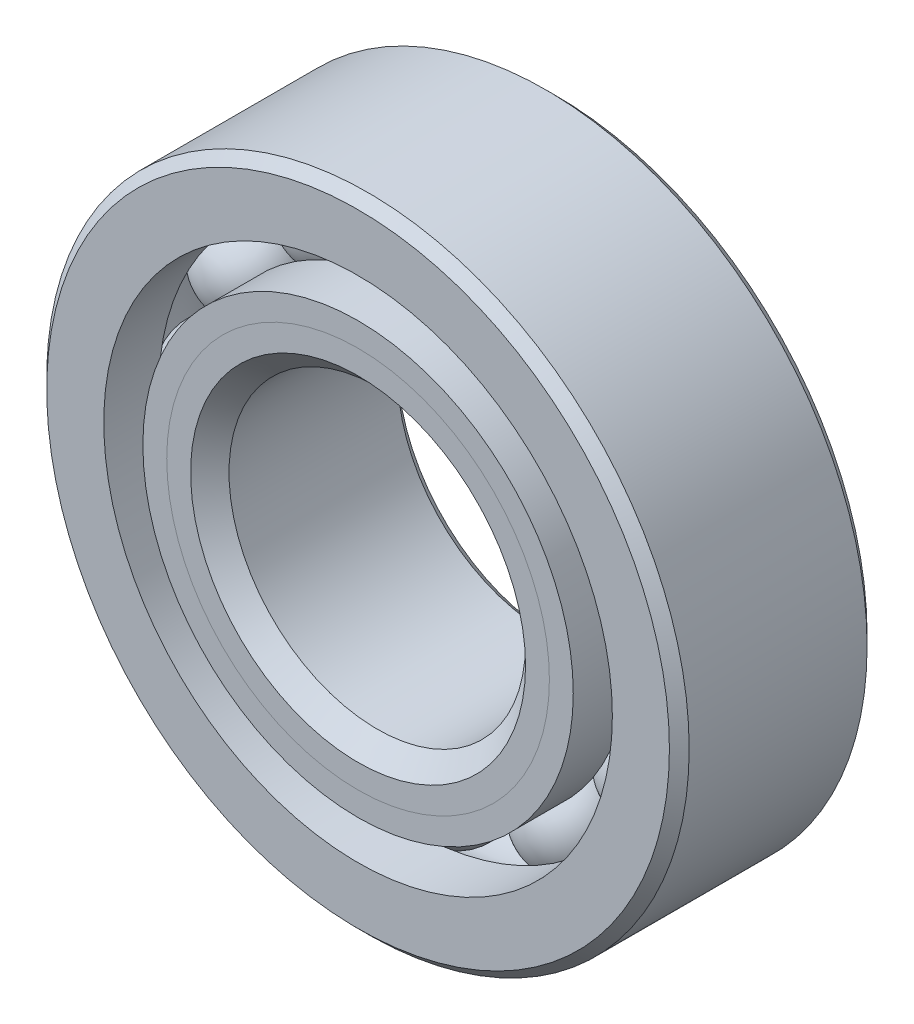
ISO-10303-21;
HEADER;
FILE_DESCRIPTION(('STEP AP214'),'2;1');
FILE_NAME('part.step','',(''),(''),'','','');
FILE_SCHEMA(('AUTOMOTIVE_DESIGN { 1 0 10303 214 1 1 1 1 }'));
ENDSEC;
DATA;
#1=APPLICATION_CONTEXT('core data for automotive mechanical design processes');
#2=APPLICATION_PROTOCOL_DEFINITION('international standard','automotive_design',2000,#1);
#3=PRODUCT_CONTEXT('',#1,'mechanical');
#4=PRODUCT('Part','Part','',(#3));
#5=PRODUCT_RELATED_PRODUCT_CATEGORY('part','',(#4));
#6=PRODUCT_DEFINITION_FORMATION('','',#4);
#7=PRODUCT_DEFINITION_CONTEXT('part definition',#1,'design');
#8=PRODUCT_DEFINITION('design','',#6,#7);
#9=PRODUCT_DEFINITION_SHAPE('','',#8);
#10=(LENGTH_UNIT() NAMED_UNIT(*) SI_UNIT(.MILLI.,.METRE.));
#11=(NAMED_UNIT(*) PLANE_ANGLE_UNIT() SI_UNIT($,.RADIAN.));
#12=(NAMED_UNIT(*) SI_UNIT($,.STERADIAN.) SOLID_ANGLE_UNIT());
#13=UNCERTAINTY_MEASURE_WITH_UNIT(LENGTH_MEASURE(1.E-05),#10,'distance_accuracy_value','');
#14=(GEOMETRIC_REPRESENTATION_CONTEXT(3) GLOBAL_UNCERTAINTY_ASSIGNED_CONTEXT((#13)) GLOBAL_UNIT_ASSIGNED_CONTEXT((#10,
#11,#12)) REPRESENTATION_CONTEXT('',''));
#15=CARTESIAN_POINT('',(0.,0.,0.));
#16=DIRECTION('',(0.,0.,1.));
#17=DIRECTION('',(1.,0.,0.));
#18=AXIS2_PLACEMENT_3D('',#15,#16,#17);
#19=CARTESIAN_POINT('',(-7.54062499999983,13.0607456208242,0.));
#20=DIRECTION('',(0.,0.,1.));
#21=DIRECTION('',(-0.499999999999989,0.866025403784445,0.));
#22=AXIS2_PLACEMENT_3D('',#19,#20,#21);
#23=SPHERICAL_SURFACE('',#22,3.08910742628344);
#24=CARTESIAN_POINT('',(-7.54062499999983,13.0607456208242,3.08910742628344));
#25=VERTEX_POINT('',#24);
#26=VERTEX_LOOP('',#25);
#27=FACE_BOUND('',#26,.T.);
#28=ADVANCED_FACE('F45',(#27),#23,.T.);
#29=CLOSED_SHELL('',(#28));
#30=MANIFOLD_SOLID_BREP('B2',#29);
#31=CARTESIAN_POINT('',(-13.060745620824,7.54062500000015,0.));
#32=DIRECTION('',(0.,0.,1.));
#33=DIRECTION('',(-0.866025403784433,0.50000000000001,0.));
#34=AXIS2_PLACEMENT_3D('',#31,#32,#33);
#35=SPHERICAL_SURFACE('',#34,3.08910742628344);
#36=CARTESIAN_POINT('',(-13.060745620824,7.54062500000015,3.08910742628344));
#37=VERTEX_POINT('',#36);
#38=VERTEX_LOOP('',#37);
#39=FACE_BOUND('',#38,.T.);
#40=ADVANCED_FACE('F81',(#39),#35,.T.);
#41=CLOSED_SHELL('',(#40));
#42=MANIFOLD_SOLID_BREP('B6',#41);
#43=CARTESIAN_POINT('',(-15.08125,1.57967708824284E-13,0.));
#44=DIRECTION('',(0.,0.,1.));
#45=DIRECTION('',(-1.,0.,0.));
#46=AXIS2_PLACEMENT_3D('',#43,#44,#45);
#47=SPHERICAL_SURFACE('',#46,3.08910742628344);
#48=CARTESIAN_POINT('',(-15.08125,1.57967708824284E-13,3.08910742628344));
#49=VERTEX_POINT('',#48);
#50=VERTEX_LOOP('',#49);
#51=FACE_BOUND('',#50,.T.);
#52=ADVANCED_FACE('F117',(#51),#47,.T.);
#53=CLOSED_SHELL('',(#52));
#54=MANIFOLD_SOLID_BREP('B41',#53);
#55=CARTESIAN_POINT('',(-13.0607456208241,-7.54062499999988,0.));
#56=DIRECTION('',(0.,0.,1.));
#57=DIRECTION('',(-0.866025403784443,-0.499999999999992,0.));
#58=AXIS2_PLACEMENT_3D('',#55,#56,#57);
#59=SPHERICAL_SURFACE('',#58,3.08910742628344);
#60=CARTESIAN_POINT('',(-13.0607456208241,-7.54062499999988,3.08910742628344));
#61=VERTEX_POINT('',#60);
#62=VERTEX_LOOP('',#61);
#63=FACE_BOUND('',#62,.T.);
#64=ADVANCED_FACE('F153',(#63),#59,.T.);
#65=CLOSED_SHELL('',(#64));
#66=MANIFOLD_SOLID_BREP('B77',#65);
#67=CARTESIAN_POINT('',(-7.54062500000011,-13.060745620824,0.));
#68=DIRECTION('',(0.,0.,1.));
#69=DIRECTION('',(-0.500000000000007,-0.866025403784435,0.));
#70=AXIS2_PLACEMENT_3D('',#67,#68,#69);
#71=SPHERICAL_SURFACE('',#70,3.08910742628344);
#72=CARTESIAN_POINT('',(-7.54062500000011,-13.060745620824,3.08910742628344));
#73=VERTEX_POINT('',#72);
#74=VERTEX_LOOP('',#73);
#75=FACE_BOUND('',#74,.T.);
#76=ADVANCED_FACE('F187',(#75),#71,.T.);
#77=CLOSED_SHELL('',(#76));
#78=MANIFOLD_SOLID_BREP('B113',#77);
#79=CARTESIAN_POINT('',(-1.05311805882856E-13,-15.08125,0.));
#80=DIRECTION('',(0.,0.,1.));
#81=DIRECTION('',(0.,-1.,0.));
#82=AXIS2_PLACEMENT_3D('',#79,#80,#81);
#83=SPHERICAL_SURFACE('',#82,3.08910742628344);
#84=CARTESIAN_POINT('',(-1.05311805882856E-13,-15.08125,3.08910742628344));
#85=VERTEX_POINT('',#84);
#86=VERTEX_LOOP('',#85);
#87=FACE_BOUND('',#86,.T.);
#88=ADVANCED_FACE('F221',(#87),#83,.T.);
#89=CLOSED_SHELL('',(#88));
#90=MANIFOLD_SOLID_BREP('B149',#89);
#91=CARTESIAN_POINT('',(7.54062499999992,-13.0607456208241,0.));
#92=DIRECTION('',(0.,0.,1.));
#93=DIRECTION('',(0.499999999999995,-0.866025403784442,0.));
#94=AXIS2_PLACEMENT_3D('',#91,#92,#93);
#95=SPHERICAL_SURFACE('',#94,3.08910742628344);
#96=CARTESIAN_POINT('',(7.54062499999992,-13.0607456208241,3.08910742628344));
#97=VERTEX_POINT('',#96);
#98=VERTEX_LOOP('',#97);
#99=FACE_BOUND('',#98,.T.);
#100=ADVANCED_FACE('F255',(#99),#95,.T.);
#101=CLOSED_SHELL('',(#100));
#102=MANIFOLD_SOLID_BREP('B183',#101);
#103=CARTESIAN_POINT('',(13.060745620824,-7.54062500000006,0.));
#104=DIRECTION('',(0.,0.,1.));
#105=DIRECTION('',(0.866025403784436,-0.500000000000004,0.));
#106=AXIS2_PLACEMENT_3D('',#103,#104,#105);
#107=SPHERICAL_SURFACE('',#106,3.08910742628344);
#108=CARTESIAN_POINT('',(13.060745620824,-7.54062500000006,3.08910742628344));
#109=VERTEX_POINT('',#108);
#110=VERTEX_LOOP('',#109);
#111=FACE_BOUND('',#110,.T.);
#112=ADVANCED_FACE('F291',(#111),#107,.T.);
#113=CLOSED_SHELL('',(#112));
#114=MANIFOLD_SOLID_BREP('B217',#113);
#115=CARTESIAN_POINT('',(15.08125,0.,0.));
#116=DIRECTION('',(0.,0.,1.));
#117=DIRECTION('',(1.,0.,0.));
#118=AXIS2_PLACEMENT_3D('',#115,#116,#117);
#119=SPHERICAL_SURFACE('',#118,3.08910742628344);
#120=CARTESIAN_POINT('',(15.08125,0.,3.08910742628344));
#121=VERTEX_POINT('',#120);
#122=VERTEX_LOOP('',#121);
#123=FACE_BOUND('',#122,.T.);
#124=ADVANCED_FACE('F327',(#123),#119,.T.);
#125=CLOSED_SHELL('',(#124));
#126=MANIFOLD_SOLID_BREP('B251',#125);
#127=CARTESIAN_POINT('',(13.0607456208241,7.54062499999997,0.));
#128=DIRECTION('',(0.,0.,1.));
#129=DIRECTION('',(0.86602540378444,0.499999999999998,0.));
#130=AXIS2_PLACEMENT_3D('',#127,#128,#129);
#131=SPHERICAL_SURFACE('',#130,3.08910742628344);
#132=CARTESIAN_POINT('',(13.0607456208241,7.54062499999997,3.08910742628344));
#133=VERTEX_POINT('',#132);
#134=VERTEX_LOOP('',#133);
#135=FACE_BOUND('',#134,.T.);
#136=ADVANCED_FACE('F361',(#135),#131,.T.);
#137=CLOSED_SHELL('',(#136));
#138=MANIFOLD_SOLID_BREP('B287',#137);
#139=CARTESIAN_POINT('',(7.54062500000001,13.0607456208241,0.));
#140=DIRECTION('',(0.,0.,1.));
#141=DIRECTION('',(0.500000000000001,0.866025403784438,0.));
#142=AXIS2_PLACEMENT_3D('',#139,#140,#141);
#143=SPHERICAL_SURFACE('',#142,3.08910742628344);
#144=CARTESIAN_POINT('',(7.54062500000001,13.0607456208241,3.08910742628344));
#145=VERTEX_POINT('',#144);
#146=VERTEX_LOOP('',#145);
#147=FACE_BOUND('',#146,.T.);
#148=ADVANCED_FACE('F395',(#147),#143,.T.);
#149=CLOSED_SHELL('',(#148));
#150=MANIFOLD_SOLID_BREP('B323',#149);
#151=CARTESIAN_POINT('',(0.,15.08125,0.));
#152=DIRECTION('',(0.,0.,1.));
#153=DIRECTION('',(0.,1.,0.));
#154=AXIS2_PLACEMENT_3D('',#151,#152,#153);
#155=SPHERICAL_SURFACE('',#154,3.08910742628344);
#156=CARTESIAN_POINT('',(0.,15.08125,3.08910742628344));
#157=VERTEX_POINT('',#156);
#158=VERTEX_LOOP('',#157);
#159=FACE_BOUND('',#158,.T.);
#160=ADVANCED_FACE('F431',(#159),#155,.T.);
#161=CLOSED_SHELL('',(#160));
#162=MANIFOLD_SOLID_BREP('B357',#161);
#163=CARTESIAN_POINT('',(0.,12.2918886654072,6.35));
#164=DIRECTION('',(0.,0.,-1.));
#165=DIRECTION('',(-1.,0.,0.));
#166=AXIS2_PLACEMENT_3D('',#163,#164,#165);
#167=PLANE('',#166);
#168=CARTESIAN_POINT('',(0.,0.,6.35));
#169=DIRECTION('',(0.,0.,1.));
#170=DIRECTION('',(1.,0.,0.));
#171=AXIS2_PLACEMENT_3D('',#168,#169,#170);
#172=CIRCLE('',#171,10.7585712868583);
#173=CARTESIAN_POINT('',(10.7585712868583,0.,6.35));
#174=VERTEX_POINT('',#173);
#175=EDGE_CURVE('E485',#174,#174,#172,.T.);
#176=ORIENTED_EDGE('',*,*,#175,.F.);
#177=EDGE_LOOP('',(#176));
#178=FACE_BOUND('',#177,.T.);
#179=CARTESIAN_POINT('',(0.,0.,6.35));
#180=DIRECTION('',(0.,0.,1.));
#181=DIRECTION('',(1.,0.,0.));
#182=AXIS2_PLACEMENT_3D('',#179,#180,#181);
#183=CIRCLE('',#182,12.2918886654072);
#184=CARTESIAN_POINT('',(12.2918886654072,0.,6.35));
#185=VERTEX_POINT('',#184);
#186=EDGE_CURVE('E430',#185,#185,#183,.T.);
#187=ORIENTED_EDGE('',*,*,#186,.T.);
#188=EDGE_LOOP('',(#187));
#189=FACE_BOUND('',#188,.T.);
#190=ADVANCED_FACE('F451',(#178,#189),#167,.F.);
#191=CARTESIAN_POINT('',(0.,0.,4.81668262145113));
#192=DIRECTION('',(0.,0.,1.));
#193=DIRECTION('',(1.,0.,0.));
#194=AXIS2_PLACEMENT_3D('',#191,#192,#193);
#195=CONICAL_SURFACE('',#194,10.7585712868583,0.78539816339745);
#196=ORIENTED_EDGE('',*,*,#186,.F.);
#197=EDGE_LOOP('',(#196));
#198=FACE_BOUND('',#197,.T.);
#199=CARTESIAN_POINT('',(0.,0.,4.81668262145113));
#200=DIRECTION('',(0.,0.,1.));
#201=DIRECTION('',(1.,0.,0.));
#202=AXIS2_PLACEMENT_3D('',#199,#200,#201);
#203=CIRCLE('',#202,10.7585712868583);
#204=CARTESIAN_POINT('',(10.7585712868583,0.,4.81668262145113));
#205=VERTEX_POINT('',#204);
#206=EDGE_CURVE('E457',#205,#205,#203,.T.);
#207=ORIENTED_EDGE('',*,*,#206,.T.);
#208=EDGE_LOOP('',(#207));
#209=FACE_BOUND('',#208,.T.);
#210=ADVANCED_FACE('F492',(#198,#209),#195,.T.);
#211=CARTESIAN_POINT('',(0.,0.,6.35));
#212=DIRECTION('',(0.,0.,1.));
#213=DIRECTION('',(1.,0.,0.));
#214=AXIS2_PLACEMENT_3D('',#211,#212,#213);
#215=CYLINDRICAL_SURFACE('',#214,10.7585712868583);
#216=ORIENTED_EDGE('',*,*,#206,.F.);
#217=EDGE_LOOP('',(#216));
#218=FACE_BOUND('',#217,.T.);
#219=CARTESIAN_POINT('',(0.,0.,0.));
#220=DIRECTION('',(0.,0.,1.));
#221=DIRECTION('',(1.,0.,0.));
#222=AXIS2_PLACEMENT_3D('',#219,#220,#221);
#223=CIRCLE('',#222,10.7585712868583);
#224=CARTESIAN_POINT('',(10.7585712868583,0.,0.));
#225=VERTEX_POINT('',#224);
#226=EDGE_CURVE('E461',#225,#225,#223,.T.);
#227=ORIENTED_EDGE('',*,*,#226,.T.);
#228=EDGE_LOOP('',(#227));
#229=FACE_BOUND('',#228,.T.);
#230=ADVANCED_FACE('F496',(#218,#229),#215,.T.);
#231=CARTESIAN_POINT('',(0.,10.7585712868583,0.));
#232=DIRECTION('',(0.,0.,-1.));
#233=DIRECTION('',(-1.,0.,0.));
#234=AXIS2_PLACEMENT_3D('',#231,#232,#233);
#235=PLANE('',#234);
#236=ORIENTED_EDGE('',*,*,#226,.F.);
#237=EDGE_LOOP('',(#236));
#238=FACE_BOUND('',#237,.T.);
#239=CARTESIAN_POINT('',(0.,0.,0.));
#240=DIRECTION('',(0.,0.,1.));
#241=DIRECTION('',(1.,0.,0.));
#242=AXIS2_PLACEMENT_3D('',#239,#240,#241);
#243=CIRCLE('',#242,11.9921425737166);
#244=CARTESIAN_POINT('',(11.9921425737166,0.,0.));
#245=VERTEX_POINT('',#244);
#246=EDGE_CURVE('E465',#245,#245,#243,.T.);
#247=ORIENTED_EDGE('',*,*,#246,.T.);
#248=EDGE_LOOP('',(#247));
#249=FACE_BOUND('',#248,.T.);
#250=ADVANCED_FACE('F501',(#238,#249),#235,.F.);
#251=CARTESIAN_POINT('',(0.,0.,0.));
#252=DIRECTION('',(0.,0.,1.));
#253=DIRECTION('',(1.,0.,0.));
#254=AXIS2_PLACEMENT_3D('',#251,#252,#253);
#255=TOROIDAL_SURFACE('',#254,15.08125,3.08910742628344);
#256=ORIENTED_EDGE('',*,*,#246,.F.);
#257=EDGE_LOOP('',(#256));
#258=FACE_BOUND('',#257,.T.);
#259=CARTESIAN_POINT('',(0.,0.,-2.82222222222222));
#260=DIRECTION('',(0.,0.,1.));
#261=DIRECTION('',(1.,0.,0.));
#262=AXIS2_PLACEMENT_3D('',#259,#260,#261);
#263=CIRCLE('',#262,13.825206043956);
#264=CARTESIAN_POINT('',(13.825206043956,0.,-2.82222222222222));
#265=VERTEX_POINT('',#264);
#266=EDGE_CURVE('E470',#265,#265,#263,.T.);
#267=ORIENTED_EDGE('',*,*,#266,.T.);
#268=EDGE_LOOP('',(#267));
#269=FACE_BOUND('',#268,.T.);
#270=ADVANCED_FACE('F507',(#258,#269),#255,.F.);
#271=CARTESIAN_POINT('',(0.,0.,6.35));
#272=DIRECTION('',(0.,0.,1.));
#273=DIRECTION('',(1.,0.,0.));
#274=AXIS2_PLACEMENT_3D('',#271,#272,#273);
#275=CYLINDRICAL_SURFACE('',#274,13.825206043956);
#276=ORIENTED_EDGE('',*,*,#266,.F.);
#277=EDGE_LOOP('',(#276));
#278=FACE_BOUND('',#277,.T.);
#279=CARTESIAN_POINT('',(0.,0.,-6.35));
#280=DIRECTION('',(0.,0.,1.));
#281=DIRECTION('',(1.,0.,0.));
#282=AXIS2_PLACEMENT_3D('',#279,#280,#281);
#283=CIRCLE('',#282,13.825206043956);
#284=CARTESIAN_POINT('',(13.825206043956,0.,-6.35));
#285=VERTEX_POINT('',#284);
#286=EDGE_CURVE('E473',#285,#285,#283,.T.);
#287=ORIENTED_EDGE('',*,*,#286,.T.);
#288=EDGE_LOOP('',(#287));
#289=FACE_BOUND('',#288,.T.);
#290=ADVANCED_FACE('F511',(#278,#289),#275,.T.);
#291=CARTESIAN_POINT('',(0.,10.16,-6.35));
#292=DIRECTION('',(0.,0.,1.));
#293=DIRECTION('',(1.,0.,0.));
#294=AXIS2_PLACEMENT_3D('',#291,#292,#293);
#295=PLANE('',#294);
#296=ORIENTED_EDGE('',*,*,#286,.F.);
#297=EDGE_LOOP('',(#296));
#298=FACE_BOUND('',#297,.T.);
#299=CARTESIAN_POINT('',(0.,0.,-6.35));
#300=DIRECTION('',(0.,0.,1.));
#301=DIRECTION('',(1.,0.,0.));
#302=AXIS2_PLACEMENT_3D('',#299,#300,#301);
#303=CIRCLE('',#302,10.16);
#304=CARTESIAN_POINT('',(10.16,0.,-6.35));
#305=VERTEX_POINT('',#304);
#306=EDGE_CURVE('E476',#305,#305,#303,.T.);
#307=ORIENTED_EDGE('',*,*,#306,.T.);
#308=EDGE_LOOP('',(#307));
#309=FACE_BOUND('',#308,.T.);
#310=ADVANCED_FACE('F515',(#298,#309),#295,.F.);
#311=CARTESIAN_POINT('',(0.,0.,-5.715));
#312=DIRECTION('',(0.,0.,-1.));
#313=DIRECTION('',(-1.,0.,0.));
#314=AXIS2_PLACEMENT_3D('',#311,#312,#313);
#315=CONICAL_SURFACE('',#314,9.525,0.78539816339745);
#316=ORIENTED_EDGE('',*,*,#306,.F.);
#317=EDGE_LOOP('',(#316));
#318=FACE_BOUND('',#317,.T.);
#319=CARTESIAN_POINT('',(0.,0.,-5.715));
#320=DIRECTION('',(0.,0.,1.));
#321=DIRECTION('',(1.,0.,0.));
#322=AXIS2_PLACEMENT_3D('',#319,#320,#321);
#323=CIRCLE('',#322,9.525);
#324=CARTESIAN_POINT('',(9.525,0.,-5.715));
#325=VERTEX_POINT('',#324);
#326=EDGE_CURVE('E479',#325,#325,#323,.T.);
#327=ORIENTED_EDGE('',*,*,#326,.T.);
#328=EDGE_LOOP('',(#327));
#329=FACE_BOUND('',#328,.T.);
#330=ADVANCED_FACE('F519',(#318,#329),#315,.F.);
#331=CARTESIAN_POINT('',(0.,0.,6.35));
#332=DIRECTION('',(0.,0.,1.));
#333=DIRECTION('',(1.,0.,0.));
#334=AXIS2_PLACEMENT_3D('',#331,#332,#333);
#335=CYLINDRICAL_SURFACE('',#334,9.525);
#336=ORIENTED_EDGE('',*,*,#326,.F.);
#337=EDGE_LOOP('',(#336));
#338=FACE_BOUND('',#337,.T.);
#339=CARTESIAN_POINT('',(0.,0.,5.11642871314172));
#340=DIRECTION('',(0.,0.,1.));
#341=DIRECTION('',(1.,0.,0.));
#342=AXIS2_PLACEMENT_3D('',#339,#340,#341);
#343=CIRCLE('',#342,9.525);
#344=CARTESIAN_POINT('',(9.525,0.,5.11642871314172));
#345=VERTEX_POINT('',#344);
#346=EDGE_CURVE('E482',#345,#345,#343,.T.);
#347=ORIENTED_EDGE('',*,*,#346,.T.);
#348=EDGE_LOOP('',(#347));
#349=FACE_BOUND('',#348,.T.);
#350=ADVANCED_FACE('F523',(#338,#349),#335,.F.);
#351=CARTESIAN_POINT('',(0.,0.,6.35));
#352=DIRECTION('',(0.,0.,1.));
#353=DIRECTION('',(1.,0.,0.));
#354=AXIS2_PLACEMENT_3D('',#351,#352,#353);
#355=CONICAL_SURFACE('',#354,10.7585712868583,0.78539816339745);
#356=ORIENTED_EDGE('',*,*,#346,.F.);
#357=EDGE_LOOP('',(#356));
#358=FACE_BOUND('',#357,.T.);
#359=ORIENTED_EDGE('',*,*,#175,.T.);
#360=EDGE_LOOP('',(#359));
#361=FACE_BOUND('',#360,.T.);
#362=ADVANCED_FACE('F489',(#358,#361),#355,.F.);
#363=CLOSED_SHELL('',(#190,#210,#230,#250,#270,#290,#310,#330,#350,#362));
#364=MANIFOLD_SOLID_BREP('B391',#363);
#365=CARTESIAN_POINT('',(0.,13.825206043956,6.35));
#366=DIRECTION('',(0.,0.,-1.));
#367=DIRECTION('',(-1.,0.,0.));
#368=AXIS2_PLACEMENT_3D('',#365,#366,#367);
#369=PLANE('',#368);
#370=CARTESIAN_POINT('',(0.,0.,6.35));
#371=DIRECTION('',(0.,0.,1.));
#372=DIRECTION('',(1.,0.,0.));
#373=AXIS2_PLACEMENT_3D('',#370,#371,#372);
#374=CIRCLE('',#373,12.2918886654072);
#375=CARTESIAN_POINT('',(12.2918886654072,0.,6.35));
#376=VERTEX_POINT('',#375);
#377=EDGE_CURVE('E450',#376,#376,#374,.T.);
#378=ORIENTED_EDGE('',*,*,#377,.F.);
#379=EDGE_LOOP('',(#378));
#380=FACE_BOUND('',#379,.T.);
#381=CARTESIAN_POINT('',(0.,0.,6.35));
#382=DIRECTION('',(0.,0.,1.));
#383=DIRECTION('',(1.,0.,0.));
#384=AXIS2_PLACEMENT_3D('',#381,#382,#383);
#385=CIRCLE('',#384,13.825206043956);
#386=CARTESIAN_POINT('',(13.825206043956,0.,6.35));
#387=VERTEX_POINT('',#386);
#388=EDGE_CURVE('E631',#387,#387,#385,.T.);
#389=ORIENTED_EDGE('',*,*,#388,.T.);
#390=EDGE_LOOP('',(#389));
#391=FACE_BOUND('',#390,.T.);
#392=ADVANCED_FACE('F609',(#380,#391),#369,.F.);
#393=CARTESIAN_POINT('',(0.,0.,6.35));
#394=DIRECTION('',(0.,0.,1.));
#395=DIRECTION('',(1.,0.,0.));
#396=AXIS2_PLACEMENT_3D('',#393,#394,#395);
#397=CONICAL_SURFACE('',#396,12.2918886654072,0.78539816339745);
#398=CARTESIAN_POINT('',(0.,0.,4.81668262145113));
#399=DIRECTION('',(0.,0.,1.));
#400=DIRECTION('',(1.,0.,0.));
#401=AXIS2_PLACEMENT_3D('',#398,#399,#400);
#402=CIRCLE('',#401,10.7585712868583);
#403=CARTESIAN_POINT('',(10.7585712868583,0.,4.81668262145113));
#404=VERTEX_POINT('',#403);
#405=EDGE_CURVE('E615',#404,#404,#402,.T.);
#406=ORIENTED_EDGE('',*,*,#405,.F.);
#407=EDGE_LOOP('',(#406));
#408=FACE_BOUND('',#407,.T.);
#409=ORIENTED_EDGE('',*,*,#377,.T.);
#410=EDGE_LOOP('',(#409));
#411=FACE_BOUND('',#410,.T.);
#412=ADVANCED_FACE('F656',(#408,#411),#397,.F.);
#413=CARTESIAN_POINT('',(0.,0.,6.35));
#414=DIRECTION('',(0.,0.,1.));
#415=DIRECTION('',(1.,0.,0.));
#416=AXIS2_PLACEMENT_3D('',#413,#414,#415);
#417=CYLINDRICAL_SURFACE('',#416,10.7585712868583);
#418=CARTESIAN_POINT('',(0.,0.,0.));
#419=DIRECTION('',(0.,0.,1.));
#420=DIRECTION('',(1.,0.,0.));
#421=AXIS2_PLACEMENT_3D('',#418,#419,#420);
#422=CIRCLE('',#421,10.7585712868583);
#423=CARTESIAN_POINT('',(10.7585712868583,0.,0.));
#424=VERTEX_POINT('',#423);
#425=EDGE_CURVE('E619',#424,#424,#422,.T.);
#426=ORIENTED_EDGE('',*,*,#425,.F.);
#427=EDGE_LOOP('',(#426));
#428=FACE_BOUND('',#427,.T.);
#429=ORIENTED_EDGE('',*,*,#405,.T.);
#430=EDGE_LOOP('',(#429));
#431=FACE_BOUND('',#430,.T.);
#432=ADVANCED_FACE('F651',(#428,#431),#417,.F.);
#433=CARTESIAN_POINT('',(0.,10.7585712868583,0.));
#434=DIRECTION('',(0.,0.,1.));
#435=DIRECTION('',(1.,0.,0.));
#436=AXIS2_PLACEMENT_3D('',#433,#434,#435);
#437=PLANE('',#436);
#438=CARTESIAN_POINT('',(0.,0.,0.));
#439=DIRECTION('',(0.,0.,1.));
#440=DIRECTION('',(1.,0.,0.));
#441=AXIS2_PLACEMENT_3D('',#438,#439,#440);
#442=CIRCLE('',#441,11.9921425737166);
#443=CARTESIAN_POINT('',(11.9921425737166,0.,0.));
#444=VERTEX_POINT('',#443);
#445=EDGE_CURVE('E623',#444,#444,#442,.T.);
#446=ORIENTED_EDGE('',*,*,#445,.F.);
#447=EDGE_LOOP('',(#446));
#448=FACE_BOUND('',#447,.T.);
#449=ORIENTED_EDGE('',*,*,#425,.T.);
#450=EDGE_LOOP('',(#449));
#451=FACE_BOUND('',#450,.T.);
#452=ADVANCED_FACE('F645',(#448,#451),#437,.F.);
#453=CARTESIAN_POINT('',(0.,0.,0.));
#454=DIRECTION('',(0.,0.,1.));
#455=DIRECTION('',(1.,0.,0.));
#456=AXIS2_PLACEMENT_3D('',#453,#454,#455);
#457=TOROIDAL_SURFACE('',#456,15.08125,3.08910742628344);
#458=CARTESIAN_POINT('',(0.,0.,2.82222222222222));
#459=DIRECTION('',(0.,0.,1.));
#460=DIRECTION('',(1.,0.,0.));
#461=AXIS2_PLACEMENT_3D('',#458,#459,#460);
#462=CIRCLE('',#461,13.825206043956);
#463=CARTESIAN_POINT('',(13.825206043956,0.,2.82222222222222));
#464=VERTEX_POINT('',#463);
#465=EDGE_CURVE('E628',#464,#464,#462,.T.);
#466=ORIENTED_EDGE('',*,*,#465,.F.);
#467=EDGE_LOOP('',(#466));
#468=FACE_BOUND('',#467,.T.);
#469=ORIENTED_EDGE('',*,*,#445,.T.);
#470=EDGE_LOOP('',(#469));
#471=FACE_BOUND('',#470,.T.);
#472=ADVANCED_FACE('F639',(#468,#471),#457,.F.);
#473=CARTESIAN_POINT('',(0.,0.,6.35));
#474=DIRECTION('',(0.,0.,1.));
#475=DIRECTION('',(1.,0.,0.));
#476=AXIS2_PLACEMENT_3D('',#473,#474,#475);
#477=CYLINDRICAL_SURFACE('',#476,13.825206043956);
#478=ORIENTED_EDGE('',*,*,#388,.F.);
#479=EDGE_LOOP('',(#478));
#480=FACE_BOUND('',#479,.T.);
#481=ORIENTED_EDGE('',*,*,#465,.T.);
#482=EDGE_LOOP('',(#481));
#483=FACE_BOUND('',#482,.T.);
#484=ADVANCED_FACE('F636',(#480,#483),#477,.T.);
#485=CLOSED_SHELL('',(#392,#412,#432,#452,#472,#484));
#486=MANIFOLD_SOLID_BREP('B425',#485);
#487=CARTESIAN_POINT('',(0.,0.,5.715));
#488=DIRECTION('',(0.,0.,-1.));
#489=DIRECTION('',(-1.,0.,0.));
#490=AXIS2_PLACEMENT_3D('',#487,#488,#489);
#491=CONICAL_SURFACE('',#490,20.6375,0.785398163397446);
#492=CARTESIAN_POINT('',(0.,0.,6.35));
#493=DIRECTION('',(0.,0.,1.));
#494=DIRECTION('',(1.,0.,0.));
#495=AXIS2_PLACEMENT_3D('',#492,#493,#494);
#496=CIRCLE('',#495,20.0025);
#497=CARTESIAN_POINT('',(20.0025,0.,6.35));
#498=VERTEX_POINT('',#497);
#499=EDGE_CURVE('E736',#498,#498,#496,.T.);
#500=ORIENTED_EDGE('',*,*,#499,.F.);
#501=EDGE_LOOP('',(#500));
#502=FACE_BOUND('',#501,.T.);
#503=CARTESIAN_POINT('',(0.,0.,5.715));
#504=DIRECTION('',(0.,0.,1.));
#505=DIRECTION('',(1.,0.,0.));
#506=AXIS2_PLACEMENT_3D('',#503,#504,#505);
#507=CIRCLE('',#506,20.6375);
#508=CARTESIAN_POINT('',(20.6375,0.,5.715));
#509=VERTEX_POINT('',#508);
#510=EDGE_CURVE('E608',#509,#509,#507,.T.);
#511=ORIENTED_EDGE('',*,*,#510,.T.);
#512=EDGE_LOOP('',(#511));
#513=FACE_BOUND('',#512,.T.);
#514=ADVANCED_FACE('F701',(#502,#513),#491,.T.);
#515=CARTESIAN_POINT('',(0.,0.,6.35));
#516=DIRECTION('',(0.,0.,1.));
#517=DIRECTION('',(1.,0.,0.));
#518=AXIS2_PLACEMENT_3D('',#515,#516,#517);
#519=CYLINDRICAL_SURFACE('',#518,20.6375);
#520=ORIENTED_EDGE('',*,*,#510,.F.);
#521=EDGE_LOOP('',(#520));
#522=FACE_BOUND('',#521,.T.);
#523=CARTESIAN_POINT('',(0.,0.,-5.715));
#524=DIRECTION('',(0.,0.,1.));
#525=DIRECTION('',(1.,0.,0.));
#526=AXIS2_PLACEMENT_3D('',#523,#524,#525);
#527=CIRCLE('',#526,20.6375);
#528=CARTESIAN_POINT('',(20.6375,0.,-5.715));
#529=VERTEX_POINT('',#528);
#530=EDGE_CURVE('E708',#529,#529,#527,.T.);
#531=ORIENTED_EDGE('',*,*,#530,.T.);
#532=EDGE_LOOP('',(#531));
#533=FACE_BOUND('',#532,.T.);
#534=ADVANCED_FACE('F744',(#522,#533),#519,.T.);
#535=CARTESIAN_POINT('',(0.,0.,-6.35));
#536=DIRECTION('',(0.,0.,1.));
#537=DIRECTION('',(1.,0.,0.));
#538=AXIS2_PLACEMENT_3D('',#535,#536,#537);
#539=CONICAL_SURFACE('',#538,20.0025,0.785398163397446);
#540=ORIENTED_EDGE('',*,*,#530,.F.);
#541=EDGE_LOOP('',(#540));
#542=FACE_BOUND('',#541,.T.);
#543=CARTESIAN_POINT('',(0.,0.,-6.35));
#544=DIRECTION('',(0.,0.,1.));
#545=DIRECTION('',(1.,0.,0.));
#546=AXIS2_PLACEMENT_3D('',#543,#544,#545);
#547=CIRCLE('',#546,20.0025);
#548=CARTESIAN_POINT('',(20.0025,0.,-6.35));
#549=VERTEX_POINT('',#548);
#550=EDGE_CURVE('E713',#549,#549,#547,.T.);
#551=ORIENTED_EDGE('',*,*,#550,.T.);
#552=EDGE_LOOP('',(#551));
#553=FACE_BOUND('',#552,.T.);
#554=ADVANCED_FACE('F748',(#542,#553),#539,.T.);
#555=CARTESIAN_POINT('',(0.,20.0025,-6.35));
#556=DIRECTION('',(0.,0.,1.));
#557=DIRECTION('',(1.,0.,0.));
#558=AXIS2_PLACEMENT_3D('',#555,#556,#557);
#559=PLANE('',#558);
#560=ORIENTED_EDGE('',*,*,#550,.F.);
#561=EDGE_LOOP('',(#560));
#562=FACE_BOUND('',#561,.T.);
#563=CARTESIAN_POINT('',(0.,0.,-6.35));
#564=DIRECTION('',(0.,0.,1.));
#565=DIRECTION('',(1.,0.,0.));
#566=AXIS2_PLACEMENT_3D('',#563,#564,#565);
#567=CIRCLE('',#566,16.337293956044);
#568=CARTESIAN_POINT('',(16.337293956044,0.,-6.35));
#569=VERTEX_POINT('',#568);
#570=EDGE_CURVE('E718',#569,#569,#567,.T.);
#571=ORIENTED_EDGE('',*,*,#570,.T.);
#572=EDGE_LOOP('',(#571));
#573=FACE_BOUND('',#572,.T.);
#574=ADVANCED_FACE('F753',(#562,#573),#559,.F.);
#575=CARTESIAN_POINT('',(0.,0.,6.35));
#576=DIRECTION('',(0.,0.,1.));
#577=DIRECTION('',(1.,0.,0.));
#578=AXIS2_PLACEMENT_3D('',#575,#576,#577);
#579=CYLINDRICAL_SURFACE('',#578,16.337293956044);
#580=ORIENTED_EDGE('',*,*,#570,.F.);
#581=EDGE_LOOP('',(#580));
#582=FACE_BOUND('',#581,.T.);
#583=CARTESIAN_POINT('',(0.,0.,-2.82222222222222));
#584=DIRECTION('',(0.,0.,1.));
#585=DIRECTION('',(1.,0.,0.));
#586=AXIS2_PLACEMENT_3D('',#583,#584,#585);
#587=CIRCLE('',#586,16.337293956044);
#588=CARTESIAN_POINT('',(16.337293956044,0.,-2.82222222222222));
#589=VERTEX_POINT('',#588);
#590=EDGE_CURVE('E724',#589,#589,#587,.T.);
#591=ORIENTED_EDGE('',*,*,#590,.T.);
#592=EDGE_LOOP('',(#591));
#593=FACE_BOUND('',#592,.T.);
#594=ADVANCED_FACE('F759',(#582,#593),#579,.F.);
#595=CARTESIAN_POINT('',(0.,0.,0.));
#596=DIRECTION('',(0.,0.,1.));
#597=DIRECTION('',(1.,0.,0.));
#598=AXIS2_PLACEMENT_3D('',#595,#596,#597);
#599=TOROIDAL_SURFACE('',#598,15.08125,3.08910742628344);
#600=ORIENTED_EDGE('',*,*,#590,.F.);
#601=EDGE_LOOP('',(#600));
#602=FACE_BOUND('',#601,.T.);
#603=CARTESIAN_POINT('',(0.,0.,2.82222222222222));
#604=DIRECTION('',(0.,0.,1.));
#605=DIRECTION('',(1.,0.,0.));
#606=AXIS2_PLACEMENT_3D('',#603,#604,#605);
#607=CIRCLE('',#606,16.337293956044);
#608=CARTESIAN_POINT('',(16.337293956044,0.,2.82222222222222));
#609=VERTEX_POINT('',#608);
#610=EDGE_CURVE('E728',#609,#609,#607,.T.);
#611=ORIENTED_EDGE('',*,*,#610,.T.);
#612=EDGE_LOOP('',(#611));
#613=FACE_BOUND('',#612,.T.);
#614=ADVANCED_FACE('F763',(#602,#613),#599,.F.);
#615=CARTESIAN_POINT('',(0.,0.,6.35));
#616=DIRECTION('',(0.,0.,1.));
#617=DIRECTION('',(1.,0.,0.));
#618=AXIS2_PLACEMENT_3D('',#615,#616,#617);
#619=CYLINDRICAL_SURFACE('',#618,16.337293956044);
#620=ORIENTED_EDGE('',*,*,#610,.F.);
#621=EDGE_LOOP('',(#620));
#622=FACE_BOUND('',#621,.T.);
#623=CARTESIAN_POINT('',(0.,0.,6.35));
#624=DIRECTION('',(0.,0.,1.));
#625=DIRECTION('',(1.,0.,0.));
#626=AXIS2_PLACEMENT_3D('',#623,#624,#625);
#627=CIRCLE('',#626,16.337293956044);
#628=CARTESIAN_POINT('',(16.337293956044,0.,6.35));
#629=VERTEX_POINT('',#628);
#630=EDGE_CURVE('E732',#629,#629,#627,.T.);
#631=ORIENTED_EDGE('',*,*,#630,.T.);
#632=EDGE_LOOP('',(#631));
#633=FACE_BOUND('',#632,.T.);
#634=ADVANCED_FACE('F767',(#622,#633),#619,.F.);
#635=CARTESIAN_POINT('',(0.,20.0025,6.35));
#636=DIRECTION('',(0.,0.,-1.));
#637=DIRECTION('',(-1.,0.,0.));
#638=AXIS2_PLACEMENT_3D('',#635,#636,#637);
#639=PLANE('',#638);
#640=ORIENTED_EDGE('',*,*,#630,.F.);
#641=EDGE_LOOP('',(#640));
#642=FACE_BOUND('',#641,.T.);
#643=ORIENTED_EDGE('',*,*,#499,.T.);
#644=EDGE_LOOP('',(#643));
#645=FACE_BOUND('',#644,.T.);
#646=ADVANCED_FACE('F741',(#642,#645),#639,.F.);
#647=CLOSED_SHELL('',(#514,#534,#554,#574,#594,#614,#634,#646));
#648=MANIFOLD_SOLID_BREP('B445',#647);
#649=ADVANCED_BREP_SHAPE_REPRESENTATION('',(#18,#30,#42,#54,#66,#78,#90,#102,#114,#126,#138,
#150,#162,#364,#486,#648),#14);
#650=SHAPE_DEFINITION_REPRESENTATION(#9,#649);
ENDSEC;
END-ISO-10303-21;
